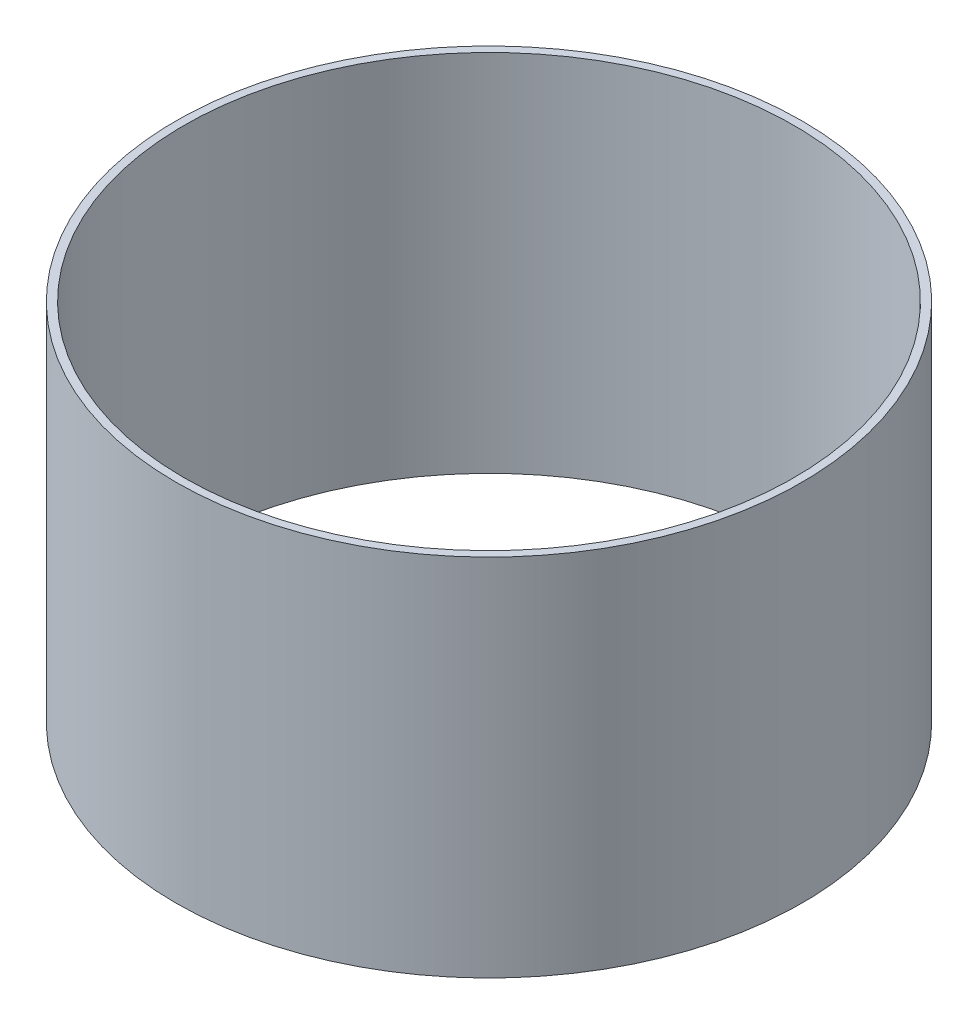
ISO-10303-21;
HEADER;
FILE_DESCRIPTION(('STEP AP214'),'2;1');
FILE_NAME('part.step','',(''),(''),'','','');
FILE_SCHEMA(('AUTOMOTIVE_DESIGN { 1 0 10303 214 1 1 1 1 }'));
ENDSEC;
DATA;
#1=APPLICATION_CONTEXT('core data for automotive mechanical design processes');
#2=APPLICATION_PROTOCOL_DEFINITION('international standard','automotive_design',2000,#1);
#3=PRODUCT_CONTEXT('',#1,'mechanical');
#4=PRODUCT('Part','Part','',(#3));
#5=PRODUCT_RELATED_PRODUCT_CATEGORY('part','',(#4));
#6=PRODUCT_DEFINITION_FORMATION('','',#4);
#7=PRODUCT_DEFINITION_CONTEXT('part definition',#1,'design');
#8=PRODUCT_DEFINITION('design','',#6,#7);
#9=PRODUCT_DEFINITION_SHAPE('','',#8);
#10=(LENGTH_UNIT() NAMED_UNIT(*) SI_UNIT(.MILLI.,.METRE.));
#11=(NAMED_UNIT(*) PLANE_ANGLE_UNIT() SI_UNIT($,.RADIAN.));
#12=(NAMED_UNIT(*) SI_UNIT($,.STERADIAN.) SOLID_ANGLE_UNIT());
#13=UNCERTAINTY_MEASURE_WITH_UNIT(LENGTH_MEASURE(1.E-05),#10,'distance_accuracy_value','');
#14=(GEOMETRIC_REPRESENTATION_CONTEXT(3) GLOBAL_UNCERTAINTY_ASSIGNED_CONTEXT((#13)) GLOBAL_UNIT_ASSIGNED_CONTEXT((#10,
#11,#12)) REPRESENTATION_CONTEXT('',''));
#15=CARTESIAN_POINT('',(0.,0.,0.));
#16=DIRECTION('',(0.,0.,1.));
#17=DIRECTION('',(1.,0.,0.));
#18=AXIS2_PLACEMENT_3D('',#15,#16,#17);
#19=CARTESIAN_POINT('',(0.,92.,0.));
#20=DIRECTION('',(0.,1.,0.));
#21=DIRECTION('',(0.,0.,1.));
#22=AXIS2_PLACEMENT_3D('',#19,#20,#21);
#23=PLANE('',#22);
#24=CARTESIAN_POINT('',(0.,92.,0.));
#25=DIRECTION('',(0.,1.,0.));
#26=DIRECTION('',(0.,0.,1.));
#27=AXIS2_PLACEMENT_3D('',#24,#25,#26);
#28=CIRCLE('',#27,79.);
#29=CARTESIAN_POINT('',(0.,92.,79.));
#30=VERTEX_POINT('',#29);
#31=EDGE_CURVE('E10',#30,#30,#28,.T.);
#32=ORIENTED_EDGE('',*,*,#31,.T.);
#33=EDGE_LOOP('',(#32));
#34=FACE_BOUND('',#33,.T.);
#35=CARTESIAN_POINT('',(0.,92.,0.));
#36=DIRECTION('',(0.,1.,0.));
#37=DIRECTION('',(0.,0.,1.));
#38=AXIS2_PLACEMENT_3D('',#35,#36,#37);
#39=CIRCLE('',#38,77.);
#40=CARTESIAN_POINT('',(0.,92.,77.));
#41=VERTEX_POINT('',#40);
#42=EDGE_CURVE('E46',#41,#41,#39,.T.);
#43=ORIENTED_EDGE('',*,*,#42,.F.);
#44=EDGE_LOOP('',(#43));
#45=FACE_BOUND('',#44,.T.);
#46=ADVANCED_FACE('F35',(#34,#45),#23,.T.);
#47=CARTESIAN_POINT('',(0.,0.,0.));
#48=DIRECTION('',(0.,1.,0.));
#49=DIRECTION('',(0.,0.,1.));
#50=AXIS2_PLACEMENT_3D('',#47,#48,#49);
#51=PLANE('',#50);
#52=CARTESIAN_POINT('',(0.,0.,0.));
#53=DIRECTION('',(0.,1.,0.));
#54=DIRECTION('',(0.,0.,1.));
#55=AXIS2_PLACEMENT_3D('',#52,#53,#54);
#56=CIRCLE('',#55,79.);
#57=CARTESIAN_POINT('',(0.,0.,79.));
#58=VERTEX_POINT('',#57);
#59=EDGE_CURVE('E39',#58,#58,#56,.T.);
#60=ORIENTED_EDGE('',*,*,#59,.F.);
#61=EDGE_LOOP('',(#60));
#62=FACE_BOUND('',#61,.T.);
#63=CARTESIAN_POINT('',(0.,0.,0.));
#64=DIRECTION('',(0.,1.,0.));
#65=DIRECTION('',(0.,0.,1.));
#66=AXIS2_PLACEMENT_3D('',#63,#64,#65);
#67=CIRCLE('',#66,77.);
#68=CARTESIAN_POINT('',(0.,0.,77.));
#69=VERTEX_POINT('',#68);
#70=EDGE_CURVE('E48',#69,#69,#67,.T.);
#71=ORIENTED_EDGE('',*,*,#70,.T.);
#72=EDGE_LOOP('',(#71));
#73=FACE_BOUND('',#72,.T.);
#74=ADVANCED_FACE('F58',(#62,#73),#51,.F.);
#75=CARTESIAN_POINT('',(0.,92.,0.));
#76=DIRECTION('',(0.,-1.,0.));
#77=DIRECTION('',(0.,0.,-1.));
#78=AXIS2_PLACEMENT_3D('',#75,#76,#77);
#79=CYLINDRICAL_SURFACE('',#78,79.);
#80=ORIENTED_EDGE('',*,*,#31,.F.);
#81=EDGE_LOOP('',(#80));
#82=FACE_BOUND('',#81,.T.);
#83=ORIENTED_EDGE('',*,*,#59,.T.);
#84=EDGE_LOOP('',(#83));
#85=FACE_BOUND('',#84,.T.);
#86=ADVANCED_FACE('F37',(#82,#85),#79,.T.);
#87=CARTESIAN_POINT('',(0.,92.,0.));
#88=DIRECTION('',(0.,-1.,0.));
#89=DIRECTION('',(0.,0.,-1.));
#90=AXIS2_PLACEMENT_3D('',#87,#88,#89);
#91=CYLINDRICAL_SURFACE('',#90,77.);
#92=ORIENTED_EDGE('',*,*,#42,.T.);
#93=EDGE_LOOP('',(#92));
#94=FACE_BOUND('',#93,.T.);
#95=ORIENTED_EDGE('',*,*,#70,.F.);
#96=EDGE_LOOP('',(#95));
#97=FACE_BOUND('',#96,.T.);
#98=ADVANCED_FACE('F54',(#94,#97),#91,.F.);
#99=CLOSED_SHELL('',(#46,#74,#86,#98));
#100=MANIFOLD_SOLID_BREP('B2',#99);
#101=ADVANCED_BREP_SHAPE_REPRESENTATION('',(#18,#100),#14);
#102=SHAPE_DEFINITION_REPRESENTATION(#9,#101);
ENDSEC;
END-ISO-10303-21;
